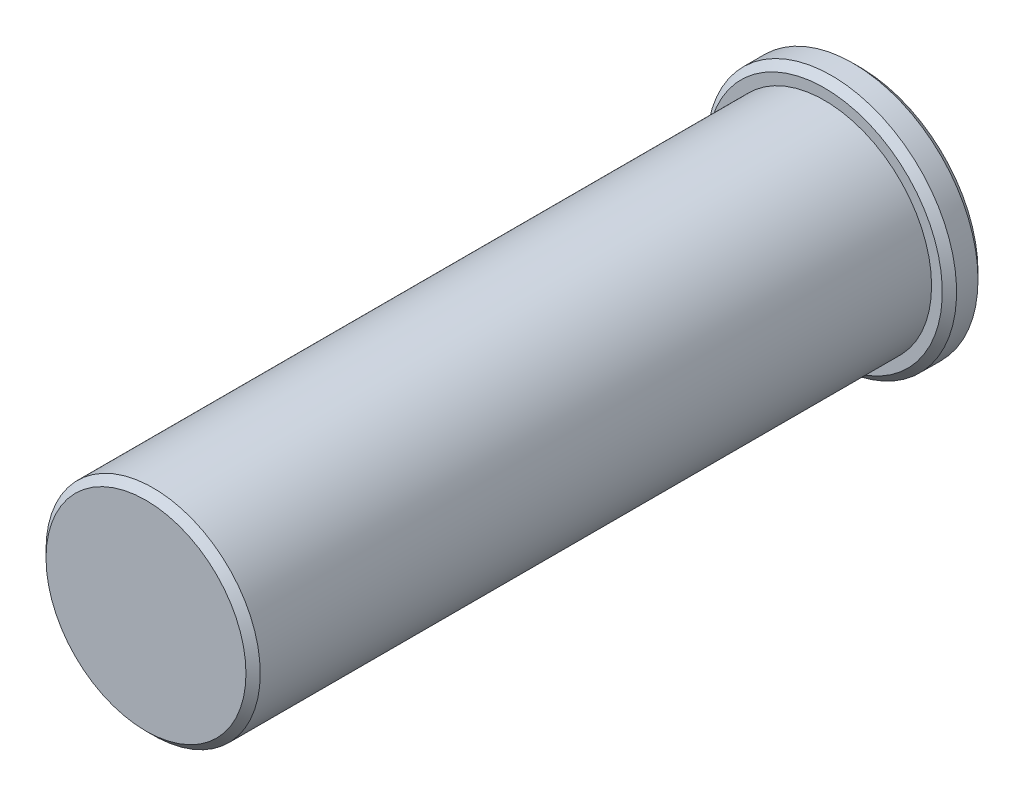
ISO-10303-21;
HEADER;
FILE_DESCRIPTION(('STEP AP214'),'2;1');
FILE_NAME('part.step','',(''),(''),'','','');
FILE_SCHEMA(('AUTOMOTIVE_DESIGN { 1 0 10303 214 1 1 1 1 }'));
ENDSEC;
DATA;
#1=APPLICATION_CONTEXT('core data for automotive mechanical design processes');
#2=APPLICATION_PROTOCOL_DEFINITION('international standard','automotive_design',2000,#1);
#3=PRODUCT_CONTEXT('',#1,'mechanical');
#4=PRODUCT('Part','Part','',(#3));
#5=PRODUCT_RELATED_PRODUCT_CATEGORY('part','',(#4));
#6=PRODUCT_DEFINITION_FORMATION('','',#4);
#7=PRODUCT_DEFINITION_CONTEXT('part definition',#1,'design');
#8=PRODUCT_DEFINITION('design','',#6,#7);
#9=PRODUCT_DEFINITION_SHAPE('','',#8);
#10=(LENGTH_UNIT() NAMED_UNIT(*) SI_UNIT(.MILLI.,.METRE.));
#11=(NAMED_UNIT(*) PLANE_ANGLE_UNIT() SI_UNIT($,.RADIAN.));
#12=(NAMED_UNIT(*) SI_UNIT($,.STERADIAN.) SOLID_ANGLE_UNIT());
#13=UNCERTAINTY_MEASURE_WITH_UNIT(LENGTH_MEASURE(1.E-05),#10,'distance_accuracy_value','');
#14=(GEOMETRIC_REPRESENTATION_CONTEXT(3) GLOBAL_UNCERTAINTY_ASSIGNED_CONTEXT((#13)) GLOBAL_UNIT_ASSIGNED_CONTEXT((#10,
#11,#12)) REPRESENTATION_CONTEXT('',''));
#15=CARTESIAN_POINT('',(0.,0.,0.));
#16=DIRECTION('',(0.,0.,1.));
#17=DIRECTION('',(1.,0.,0.));
#18=AXIS2_PLACEMENT_3D('',#15,#16,#17);
#19=CARTESIAN_POINT('',(0.,0.,10.));
#20=DIRECTION('',(0.,0.,-1.));
#21=DIRECTION('',(-1.,0.,0.));
#22=AXIS2_PLACEMENT_3D('',#19,#20,#21);
#23=CYLINDRICAL_SURFACE('',#22,1.5);
#24=CARTESIAN_POINT('',(0.,0.,9.9));
#25=DIRECTION('',(0.,0.,1.));
#26=DIRECTION('',(1.,0.,0.));
#27=AXIS2_PLACEMENT_3D('',#24,#25,#26);
#28=CIRCLE('',#27,1.5);
#29=CARTESIAN_POINT('',(1.5,0.,9.9));
#30=VERTEX_POINT('',#29);
#31=EDGE_CURVE('E10',#30,#30,#28,.F.);
#32=ORIENTED_EDGE('',*,*,#31,.T.);
#33=EDGE_LOOP('',(#32));
#34=FACE_BOUND('',#33,.T.);
#35=CARTESIAN_POINT('',(0.,0.,0.5));
#36=DIRECTION('',(0.,0.,-1.));
#37=DIRECTION('',(-1.,0.,0.));
#38=AXIS2_PLACEMENT_3D('',#35,#36,#37);
#39=CIRCLE('',#38,1.5);
#40=CARTESIAN_POINT('',(-1.5,0.,0.5));
#41=VERTEX_POINT('',#40);
#42=EDGE_CURVE('E60',#41,#41,#39,.T.);
#43=ORIENTED_EDGE('',*,*,#42,.F.);
#44=EDGE_LOOP('',(#43));
#45=FACE_BOUND('',#44,.T.);
#46=ADVANCED_FACE('F33',(#34,#45),#23,.T.);
#47=CARTESIAN_POINT('',(0.,0.,10.));
#48=DIRECTION('',(0.,0.,1.));
#49=DIRECTION('',(1.,0.,0.));
#50=AXIS2_PLACEMENT_3D('',#47,#48,#49);
#51=PLANE('',#50);
#52=CARTESIAN_POINT('',(0.,0.,10.));
#53=DIRECTION('',(0.,0.,1.));
#54=DIRECTION('',(1.,0.,0.));
#55=AXIS2_PLACEMENT_3D('',#52,#53,#54);
#56=CIRCLE('',#55,1.4);
#57=CARTESIAN_POINT('',(1.4,0.,10.));
#58=VERTEX_POINT('',#57);
#59=EDGE_CURVE('E41',#58,#58,#56,.T.);
#60=ORIENTED_EDGE('',*,*,#59,.T.);
#61=EDGE_LOOP('',(#60));
#62=FACE_BOUND('',#61,.T.);
#63=ADVANCED_FACE('F98',(#62),#51,.T.);
#64=CARTESIAN_POINT('',(0.,0.,0.5));
#65=DIRECTION('',(0.,0.,-1.));
#66=DIRECTION('',(-1.,0.,0.));
#67=AXIS2_PLACEMENT_3D('',#64,#65,#66);
#68=CYLINDRICAL_SURFACE('',#67,1.75);
#69=CARTESIAN_POINT('',(0.,0.,0.0999999999999968));
#70=DIRECTION('',(0.,0.,1.));
#71=DIRECTION('',(1.,0.,0.));
#72=AXIS2_PLACEMENT_3D('',#69,#70,#71);
#73=CIRCLE('',#72,1.75);
#74=CARTESIAN_POINT('',(1.75,0.,0.0999999999999968));
#75=VERTEX_POINT('',#74);
#76=EDGE_CURVE('E49',#75,#75,#73,.T.);
#77=ORIENTED_EDGE('',*,*,#76,.T.);
#78=EDGE_LOOP('',(#77));
#79=FACE_BOUND('',#78,.T.);
#80=CARTESIAN_POINT('',(0.,0.,0.400000000000001));
#81=DIRECTION('',(0.,0.,-1.));
#82=DIRECTION('',(-1.,0.,0.));
#83=AXIS2_PLACEMENT_3D('',#80,#81,#82);
#84=CIRCLE('',#83,1.75);
#85=CARTESIAN_POINT('',(-1.75,0.,0.400000000000001));
#86=VERTEX_POINT('',#85);
#87=EDGE_CURVE('E54',#86,#86,#84,.T.);
#88=ORIENTED_EDGE('',*,*,#87,.T.);
#89=EDGE_LOOP('',(#88));
#90=FACE_BOUND('',#89,.T.);
#91=ADVANCED_FACE('F102',(#79,#90),#68,.T.);
#92=CARTESIAN_POINT('',(0.,0.,0.5));
#93=DIRECTION('',(0.,0.,-1.));
#94=DIRECTION('',(-1.,0.,0.));
#95=AXIS2_PLACEMENT_3D('',#92,#93,#94);
#96=PLANE('',#95);
#97=CARTESIAN_POINT('',(0.,0.,0.5));
#98=DIRECTION('',(0.,0.,-1.));
#99=DIRECTION('',(-1.,0.,0.));
#100=AXIS2_PLACEMENT_3D('',#97,#98,#99);
#101=CIRCLE('',#100,1.65);
#102=CARTESIAN_POINT('',(-1.65,0.,0.5));
#103=VERTEX_POINT('',#102);
#104=EDGE_CURVE('E45',#103,#103,#101,.F.);
#105=ORIENTED_EDGE('',*,*,#104,.T.);
#106=EDGE_LOOP('',(#105));
#107=FACE_BOUND('',#106,.T.);
#108=ORIENTED_EDGE('',*,*,#42,.T.);
#109=EDGE_LOOP('',(#108));
#110=FACE_BOUND('',#109,.T.);
#111=ADVANCED_FACE('F82',(#107,#110),#96,.F.);
#112=CARTESIAN_POINT('',(0.,0.,0.));
#113=DIRECTION('',(0.,0.,1.));
#114=DIRECTION('',(1.,0.,0.));
#115=AXIS2_PLACEMENT_3D('',#112,#113,#114);
#116=PLANE('',#115);
#117=CARTESIAN_POINT('',(0.,0.,0.));
#118=DIRECTION('',(0.,0.,-1.));
#119=DIRECTION('',(-1.,0.,0.));
#120=AXIS2_PLACEMENT_3D('',#117,#118,#119);
#121=CIRCLE('',#120,1.);
#122=CARTESIAN_POINT('',(-1.,0.,0.));
#123=VERTEX_POINT('',#122);
#124=EDGE_CURVE('E64',#123,#123,#121,.T.);
#125=ORIENTED_EDGE('',*,*,#124,.F.);
#126=EDGE_LOOP('',(#125));
#127=FACE_BOUND('',#126,.T.);
#128=CARTESIAN_POINT('',(0.,0.,0.));
#129=DIRECTION('',(0.,0.,1.));
#130=DIRECTION('',(1.,0.,0.));
#131=AXIS2_PLACEMENT_3D('',#128,#129,#130);
#132=CIRCLE('',#131,1.65);
#133=CARTESIAN_POINT('',(1.65,0.,0.));
#134=VERTEX_POINT('',#133);
#135=EDGE_CURVE('E57',#134,#134,#132,.F.);
#136=ORIENTED_EDGE('',*,*,#135,.T.);
#137=EDGE_LOOP('',(#136));
#138=FACE_BOUND('',#137,.T.);
#139=ADVANCED_FACE('F78',(#127,#138),#116,.F.);
#140=CARTESIAN_POINT('',(0.,0.,0.));
#141=DIRECTION('',(0.,0.,1.));
#142=DIRECTION('',(1.,0.,0.));
#143=AXIS2_PLACEMENT_3D('',#140,#141,#142);
#144=CONICAL_SURFACE('',#143,1.65,0.785398163397454);
#145=CARTESIAN_POINT('',(1.75,0.,0.0999999999999968));
#146=CARTESIAN_POINT('',(1.74895833333333,0.,0.0989583333333301));
#147=CARTESIAN_POINT('',(1.74791666666667,0.,0.0979166666666635));
#148=CARTESIAN_POINT('',(1.74583333333333,0.,0.0958333333333302));
#149=CARTESIAN_POINT('',(1.74479166666667,0.,0.0947916666666636));
#150=CARTESIAN_POINT('',(1.74270833333333,0.,0.0927083333333304));
#151=CARTESIAN_POINT('',(1.74166666666667,0.,0.0916666666666637));
#152=CARTESIAN_POINT('',(1.73958333333333,0.,0.0895833333333304));
#153=CARTESIAN_POINT('',(1.73854166666667,0.,0.0885416666666638));
#154=CARTESIAN_POINT('',(1.73645833333333,0.,0.0864583333333305));
#155=CARTESIAN_POINT('',(1.73541666666667,0.,0.0854166666666639));
#156=CARTESIAN_POINT('',(1.73333333333333,0.,0.0833333333333306));
#157=CARTESIAN_POINT('',(1.73229166666667,0.,0.082291666666664));
#158=CARTESIAN_POINT('',(1.73020833333333,0.,0.0802083333333308));
#159=CARTESIAN_POINT('',(1.72916666666667,0.,0.0791666666666641));
#160=CARTESIAN_POINT('',(1.72708333333333,0.,0.0770833333333309));
#161=CARTESIAN_POINT('',(1.72604166666667,0.,0.0760416666666642));
#162=CARTESIAN_POINT('',(1.72395833333333,0.,0.0739583333333309));
#163=CARTESIAN_POINT('',(1.72291666666667,0.,0.0729166666666643));
#164=CARTESIAN_POINT('',(1.72083333333333,0.,0.070833333333331));
#165=CARTESIAN_POINT('',(1.71979166666667,0.,0.0697916666666644));
#166=CARTESIAN_POINT('',(1.71770833333333,0.,0.0677083333333312));
#167=CARTESIAN_POINT('',(1.71666666666667,0.,0.0666666666666645));
#168=CARTESIAN_POINT('',(1.71458333333333,0.,0.0645833333333312));
#169=CARTESIAN_POINT('',(1.71354166666667,0.,0.0635416666666646));
#170=CARTESIAN_POINT('',(1.71145833333333,0.,0.0614583333333313));
#171=CARTESIAN_POINT('',(1.71041666666667,0.,0.0604166666666647));
#172=CARTESIAN_POINT('',(1.70833333333333,0.,0.0583333333333315));
#173=CARTESIAN_POINT('',(1.70729166666667,0.,0.0572916666666648));
#174=CARTESIAN_POINT('',(1.70520833333333,0.,0.0552083333333315));
#175=CARTESIAN_POINT('',(1.70416666666667,0.,0.0541666666666649));
#176=CARTESIAN_POINT('',(1.70208333333333,0.,0.0520833333333316));
#177=CARTESIAN_POINT('',(1.70104166666667,0.,0.051041666666665));
#178=CARTESIAN_POINT('',(1.69895833333333,0.,0.0489583333333318));
#179=CARTESIAN_POINT('',(1.69791666666667,0.,0.0479166666666651));
#180=CARTESIAN_POINT('',(1.69583333333333,0.,0.0458333333333319));
#181=CARTESIAN_POINT('',(1.69479166666667,0.,0.0447916666666652));
#182=CARTESIAN_POINT('',(1.69270833333333,0.,0.042708333333332));
#183=CARTESIAN_POINT('',(1.69166666666667,0.,0.0416666666666653));
#184=CARTESIAN_POINT('',(1.68958333333333,0.,0.039583333333332));
#185=CARTESIAN_POINT('',(1.68854166666667,0.,0.0385416666666654));
#186=CARTESIAN_POINT('',(1.68645833333333,0.,0.0364583333333322));
#187=CARTESIAN_POINT('',(1.68541666666667,0.,0.0354166666666655));
#188=CARTESIAN_POINT('',(1.68333333333333,0.,0.0333333333333323));
#189=CARTESIAN_POINT('',(1.68229166666667,0.,0.0322916666666656));
#190=CARTESIAN_POINT('',(1.68020833333334,0.,0.0302083333333324));
#191=CARTESIAN_POINT('',(1.67916666666667,0.,0.0291666666666657));
#192=CARTESIAN_POINT('',(1.67708333333333,0.,0.0270833333333324));
#193=CARTESIAN_POINT('',(1.67604166666667,0.,0.0260416666666658));
#194=CARTESIAN_POINT('',(1.67395833333333,0.,0.0239583333333326));
#195=CARTESIAN_POINT('',(1.67291666666667,0.,0.0229166666666659));
#196=CARTESIAN_POINT('',(1.67083333333334,0.,0.0208333333333326));
#197=CARTESIAN_POINT('',(1.66979166666667,0.,0.019791666666666));
#198=CARTESIAN_POINT('',(1.66770833333334,0.,0.0177083333333328));
#199=CARTESIAN_POINT('',(1.66666666666667,0.,0.0166666666666661));
#200=CARTESIAN_POINT('',(1.66458333333334,0.,0.0145833333333329));
#201=CARTESIAN_POINT('',(1.66354166666667,0.,0.0135416666666662));
#202=CARTESIAN_POINT('',(1.66145833333334,0.,0.011458333333333));
#203=CARTESIAN_POINT('',(1.66041666666667,0.,0.0104166666666663));
#204=CARTESIAN_POINT('',(1.65833333333334,0.,0.00833333333333306));
#205=CARTESIAN_POINT('',(1.65729166666667,0.,0.00729166666666641));
#206=CARTESIAN_POINT('',(1.65520833333334,0.,0.00520833333333315));
#207=CARTESIAN_POINT('',(1.65416666666667,0.,0.00416666666666653));
#208=CARTESIAN_POINT('',(1.65208333333334,0.,0.0020833333333333));
#209=CARTESIAN_POINT('',(1.65104166666667,0.,0.00104166666666669));
#210=CARTESIAN_POINT('',(1.65,0.,0.));
#211=B_SPLINE_CURVE_WITH_KNOTS('',3,(#145,#146,#147,#148,#149,#150,#151,#152,#153,#154,#155,
#156,#157,#158,#159,#160,#161,#162,#163,#164,#165,#166,#167,#168,#169,#170,#171,#172,#173,#174,
#175,#176,#177,#178,#179,#180,#181,#182,#183,#184,#185,#186,#187,#188,#189,#190,#191,#192,#193,
#194,#195,#196,#197,#198,#199,#200,#201,#202,#203,#204,#205,#206,#207,#208,#209,#210),
.UNSPECIFIED.,.F.,.F.,(4,2,2,2,2,2,2,2,2,2,2,2,2,2,2,2,2,2,2,2,2,2,2,2,2,2,2,2,2,2,2,2,4),(0.,
0.00441941738241576,0.00883883476483168,0.0132582521472474,0.0176776695296632,0.022097086912079,
0.0265165042944949,0.0309359216769106,0.0353553390593264,0.0397747564417422,0.0441941738241581,
0.0486135912065738,0.0530330085889896,0.0574524259714055,0.0618718433538213,0.066291260736237,
0.0707106781186529,0.0751300955010687,0.0795495128834845,0.0839689302659002,0.0883883476483161,
0.0928077650307319,0.0972271824131477,0.101646599795563,0.106066017177979,0.110485434560395,
0.114904851942811,0.119324269325227,0.123743686707643,0.128163104090058,0.132582521472474,
0.13700193885489,0.141421356237306),.UNSPECIFIED.);
#212=EDGE_CURVE('BSEAM81',#75,#134,#211,.T.);
#213=ORIENTED_EDGE('',*,*,#76,.F.);
#214=ORIENTED_EDGE('',*,*,#135,.F.);
#215=ORIENTED_EDGE('',*,*,#212,.T.);
#216=ORIENTED_EDGE('',*,*,#212,.F.);
#217=EDGE_LOOP('',(#213,#215,#214,#216));
#218=FACE_BOUND('',#217,.T.);
#219=ADVANCED_FACE('F81',(#218),#144,.T.);
#220=CARTESIAN_POINT('',(0.,0.,0.400000000000001));
#221=DIRECTION('',(0.,0.,-1.));
#222=DIRECTION('',(-1.,0.,0.));
#223=AXIS2_PLACEMENT_3D('',#220,#221,#222);
#224=CONICAL_SURFACE('',#223,1.75,0.785398163397454);
#225=ORIENTED_EDGE('',*,*,#104,.F.);
#226=EDGE_LOOP('',(#225));
#227=FACE_BOUND('',#226,.T.);
#228=ORIENTED_EDGE('',*,*,#87,.F.);
#229=EDGE_LOOP('',(#228));
#230=FACE_BOUND('',#229,.T.);
#231=ADVANCED_FACE('F87',(#227,#230),#224,.T.);
#232=CARTESIAN_POINT('',(0.,0.,10.));
#233=DIRECTION('',(0.,0.,-1.));
#234=DIRECTION('',(-1.,0.,0.));
#235=AXIS2_PLACEMENT_3D('',#232,#233,#234);
#236=CONICAL_SURFACE('',#235,1.4,0.785398163397453);
#237=ORIENTED_EDGE('',*,*,#31,.F.);
#238=EDGE_LOOP('',(#237));
#239=FACE_BOUND('',#238,.T.);
#240=ORIENTED_EDGE('',*,*,#59,.F.);
#241=EDGE_LOOP('',(#240));
#242=FACE_BOUND('',#241,.T.);
#243=ADVANCED_FACE('F36',(#239,#242),#236,.T.);
#244=CARTESIAN_POINT('',(0.,0.,5.));
#245=DIRECTION('',(0.,0.,-1.));
#246=DIRECTION('',(-1.,0.,0.));
#247=AXIS2_PLACEMENT_3D('',#244,#245,#246);
#248=CYLINDRICAL_SURFACE('',#247,1.);
#249=CARTESIAN_POINT('',(0.,0.,5.));
#250=DIRECTION('',(0.,0.,-1.));
#251=DIRECTION('',(-1.,0.,0.));
#252=AXIS2_PLACEMENT_3D('',#249,#250,#251);
#253=CIRCLE('',#252,1.);
#254=CARTESIAN_POINT('',(-1.,0.,5.));
#255=VERTEX_POINT('',#254);
#256=EDGE_CURVE('E63',#255,#255,#253,.T.);
#257=ORIENTED_EDGE('',*,*,#256,.F.);
#258=EDGE_LOOP('',(#257));
#259=FACE_BOUND('',#258,.T.);
#260=ORIENTED_EDGE('',*,*,#124,.T.);
#261=EDGE_LOOP('',(#260));
#262=FACE_BOUND('',#261,.T.);
#263=ADVANCED_FACE('F72',(#259,#262),#248,.F.);
#264=CARTESIAN_POINT('',(0.,0.,5.));
#265=DIRECTION('',(0.,0.,-1.));
#266=DIRECTION('',(-1.,0.,0.));
#267=AXIS2_PLACEMENT_3D('',#264,#265,#266);
#268=PLANE('',#267);
#269=ORIENTED_EDGE('',*,*,#256,.T.);
#270=EDGE_LOOP('',(#269));
#271=FACE_BOUND('',#270,.T.);
#272=ADVANCED_FACE('F70',(#271),#268,.T.);
#273=CLOSED_SHELL('',(#46,#63,#91,#111,#139,#219,#231,#243,#263,#272));
#274=MANIFOLD_SOLID_BREP('B2',#273);
#275=ADVANCED_BREP_SHAPE_REPRESENTATION('',(#18,#274),#14);
#276=SHAPE_DEFINITION_REPRESENTATION(#9,#275);
ENDSEC;
END-ISO-10303-21;
